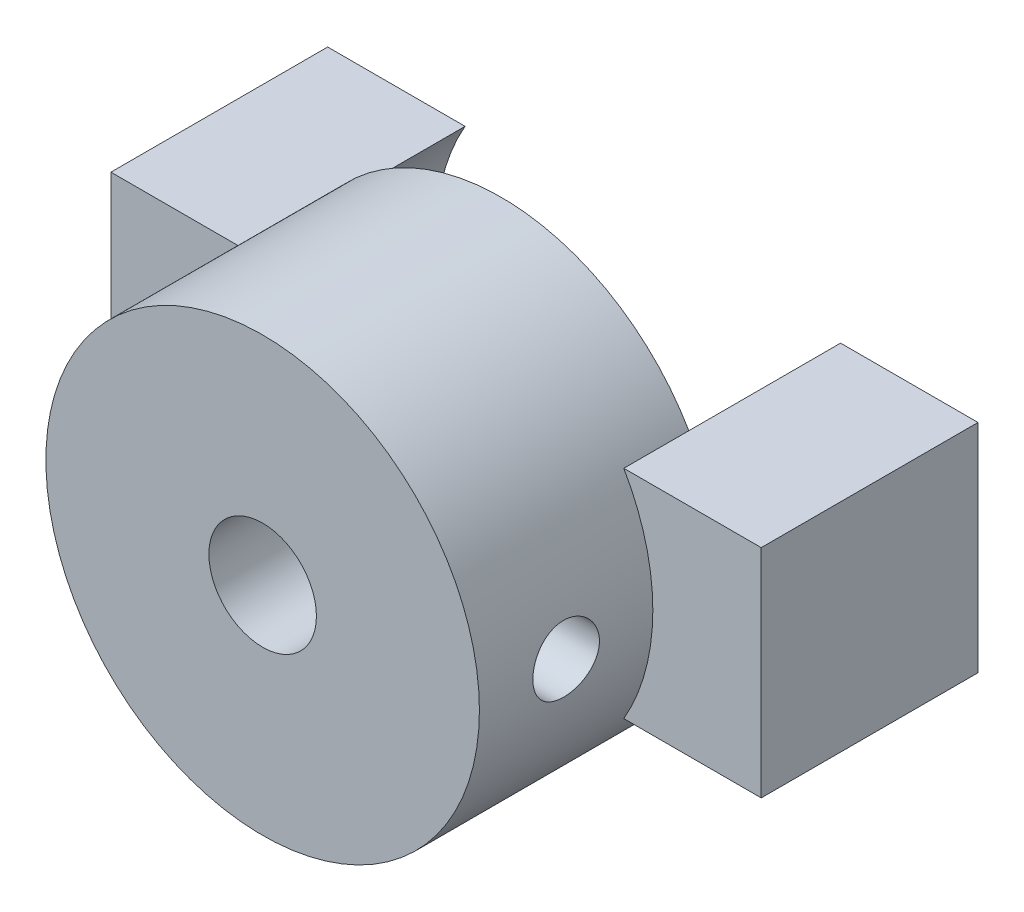
ISO-10303-21;
HEADER;
FILE_DESCRIPTION(('STEP AP214'),'2;1');
FILE_NAME('part.step','',(''),(''),'','','');
FILE_SCHEMA(('AUTOMOTIVE_DESIGN { 1 0 10303 214 1 1 1 1 }'));
ENDSEC;
DATA;
#1=APPLICATION_CONTEXT('core data for automotive mechanical design processes');
#2=APPLICATION_PROTOCOL_DEFINITION('international standard','automotive_design',2000,#1);
#3=PRODUCT_CONTEXT('',#1,'mechanical');
#4=PRODUCT('Part','Part','',(#3));
#5=PRODUCT_RELATED_PRODUCT_CATEGORY('part','',(#4));
#6=PRODUCT_DEFINITION_FORMATION('','',#4);
#7=PRODUCT_DEFINITION_CONTEXT('part definition',#1,'design');
#8=PRODUCT_DEFINITION('design','',#6,#7);
#9=PRODUCT_DEFINITION_SHAPE('','',#8);
#10=(LENGTH_UNIT() NAMED_UNIT(*) SI_UNIT(.MILLI.,.METRE.));
#11=(NAMED_UNIT(*) PLANE_ANGLE_UNIT() SI_UNIT($,.RADIAN.));
#12=(NAMED_UNIT(*) SI_UNIT($,.STERADIAN.) SOLID_ANGLE_UNIT());
#13=UNCERTAINTY_MEASURE_WITH_UNIT(LENGTH_MEASURE(1.E-05),#10,'distance_accuracy_value','');
#14=(GEOMETRIC_REPRESENTATION_CONTEXT(3) GLOBAL_UNCERTAINTY_ASSIGNED_CONTEXT((#13)) GLOBAL_UNIT_ASSIGNED_CONTEXT((#10,
#11,#12)) REPRESENTATION_CONTEXT('',''));
#15=CARTESIAN_POINT('',(0.,0.,0.));
#16=DIRECTION('',(0.,0.,1.));
#17=DIRECTION('',(1.,0.,0.));
#18=AXIS2_PLACEMENT_3D('',#15,#16,#17);
#19=CARTESIAN_POINT('',(0.,0.,10.16));
#20=DIRECTION('',(0.,0.,-1.));
#21=DIRECTION('',(-1.,0.,0.));
#22=AXIS2_PLACEMENT_3D('',#19,#20,#21);
#23=CYLINDRICAL_SURFACE('',#22,12.7);
#24=CARTESIAN_POINT('',(12.7,0.,3.13));
#25=CARTESIAN_POINT('',(12.6999982276334,-0.108845962136207,3.130004464785));
#26=CARTESIAN_POINT('',(12.6985860490651,-0.21775431783551,3.13914418871415));
#27=CARTESIAN_POINT('',(12.6930885153027,-0.432524757757705,3.1754511307624));
#28=CARTESIAN_POINT('',(12.689000586835,-0.538383807040032,3.20263570300041));
#29=CARTESIAN_POINT('',(12.6786107656927,-0.743916574575621,3.27419911693747));
#30=CARTESIAN_POINT('',(12.6723105749625,-0.843594978578481,3.31856474354612));
#31=CARTESIAN_POINT('',(12.6581916935447,-1.03407773570442,3.42319811174313));
#32=CARTESIAN_POINT('',(12.6503732061462,-1.12488327439649,3.48346372482443));
#33=CARTESIAN_POINT('',(12.634015193839,-1.29579923293581,3.61871077048814));
#34=CARTESIAN_POINT('',(12.6254708178505,-1.37582665711002,3.69379651169237));
#35=CARTESIAN_POINT('',(12.6086618295812,-1.52219845371974,3.85632792478003));
#36=CARTESIAN_POINT('',(12.6003972337249,-1.588542024011,3.94377432073599));
#37=CARTESIAN_POINT('',(12.5850365060908,-1.70598792216229,4.12910499744861));
#38=CARTESIAN_POINT('',(12.5779466438119,-1.75700958251657,4.22704096277609));
#39=CARTESIAN_POINT('',(12.5658045845477,-1.84184776138051,4.43021959923667));
#40=CARTESIAN_POINT('',(12.5607522711357,-1.87566526297326,4.53546185248191));
#41=CARTESIAN_POINT('',(12.5533051710426,-1.92487663642757,4.74939129218672));
#42=CARTESIAN_POINT('',(12.5508898627073,-1.94041285141828,4.85804500714838));
#43=CARTESIAN_POINT('',(12.5489279877153,-1.95306167734145,5.07644203520657));
#44=CARTESIAN_POINT('',(12.5493812485684,-1.95017539603901,5.18618528239212));
#45=CARTESIAN_POINT('',(12.5530865393468,-1.92617740739112,5.4026384856099));
#46=CARTESIAN_POINT('',(12.5563141805778,-1.90522451289819,5.50936652684885));
#47=CARTESIAN_POINT('',(12.5651664439985,-1.84593680702185,5.7177739287614));
#48=CARTESIAN_POINT('',(12.5707911369561,-1.80760148245623,5.81945314027986));
#49=CARTESIAN_POINT('',(12.5838305605825,-1.71447279252728,6.01535819384564));
#50=CARTESIAN_POINT('',(12.5912525536625,-1.65961242876382,6.10955168321464));
#51=CARTESIAN_POINT('',(12.6070450996551,-1.5350386290733,6.28745627807981));
#52=CARTESIAN_POINT('',(12.6154157177334,-1.46532417245795,6.37116666260907));
#53=CARTESIAN_POINT('',(12.6322699924622,-1.31215069403324,6.52664900715174));
#54=CARTESIAN_POINT('',(12.6407539139063,-1.22855518719407,6.59828654843457));
#55=CARTESIAN_POINT('',(12.6567974172646,-1.05045702232487,6.72653625053314));
#56=CARTESIAN_POINT('',(12.664356994773,-0.955954312312517,6.78314833973529));
#57=CARTESIAN_POINT('',(12.6777085014377,-0.758605798799996,6.87974812302985));
#58=CARTESIAN_POINT('',(12.6834992946071,-0.655754687046985,6.91972513933148));
#59=CARTESIAN_POINT('',(12.6926513527298,-0.444689917145736,6.9818015107654));
#60=CARTESIAN_POINT('',(12.6960127898596,-0.336476639612886,7.00390213287006));
#61=CARTESIAN_POINT('',(12.6999045182832,-0.118919124610768,7.02941890977015));
#62=CARTESIAN_POINT('',(12.7004628013309,-0.00959703767195736,7.03301980767911));
#63=CARTESIAN_POINT('',(12.6987616105735,0.208089540710071,7.02192572804797));
#64=CARTESIAN_POINT('',(12.696502228297,0.316454063143514,7.007231344809));
#65=CARTESIAN_POINT('',(12.6894368877889,0.528587595405808,6.96011745543652));
#66=CARTESIAN_POINT('',(12.6846439073081,0.632377130595833,6.92778825275461));
#67=CARTESIAN_POINT('',(12.6730469560241,0.833062763389067,6.84641787269893));
#68=CARTESIAN_POINT('',(12.6662428869044,0.929958523687307,6.79737587826511));
#69=CARTESIAN_POINT('',(12.6513100570549,1.1149164346843,6.68354072442314));
#70=CARTESIAN_POINT('',(12.6431716258307,1.20290588834609,6.61863073992604));
#71=CARTESIAN_POINT('',(12.626505207449,1.36680863824156,6.47506441329139));
#72=CARTESIAN_POINT('',(12.6179771965319,1.44272119666003,6.39640723191031));
#73=CARTESIAN_POINT('',(12.6014036593707,1.58099007290304,6.22675558040914));
#74=CARTESIAN_POINT('',(12.5933629915018,1.64322234551384,6.13565946402289));
#75=CARTESIAN_POINT('',(12.5787615338997,1.7515010437453,5.94419811154869));
#76=CARTESIAN_POINT('',(12.5722007026998,1.79754792291831,5.8438331352953));
#77=CARTESIAN_POINT('',(12.561337197173,1.87195784516515,5.63704823266879));
#78=CARTESIAN_POINT('',(12.5570262887373,1.90038544274173,5.53065198748207));
#79=CARTESIAN_POINT('',(12.5511290813638,1.9389548572117,5.31452394717424));
#80=CARTESIAN_POINT('',(12.5495425844558,1.94909800275374,5.20479239500412));
#81=CARTESIAN_POINT('',(12.5492814572718,1.95077786083979,4.98634545642706));
#82=CARTESIAN_POINT('',(12.5505762972209,1.94250965387869,4.8776315566246));
#83=CARTESIAN_POINT('',(12.5558654830242,1.90802033015738,4.66316020534619));
#84=CARTESIAN_POINT('',(12.5598598237104,1.88179924776693,4.5574027482107));
#85=CARTESIAN_POINT('',(12.5700870851371,1.81221866981808,4.35190479131503));
#86=CARTESIAN_POINT('',(12.5763181397021,1.76887345854965,4.25215935628157));
#87=CARTESIAN_POINT('',(12.5903189163086,1.6662945586338,4.06132481821611));
#88=CARTESIAN_POINT('',(12.5980886954519,1.6070602803165,3.97023603661696));
#89=CARTESIAN_POINT('',(12.6143893449349,1.47367847256626,3.79831044547203));
#90=CARTESIAN_POINT('',(12.6229270971098,1.39938664760008,3.71758622091338));
#91=CARTESIAN_POINT('',(12.6397447796645,1.23830356168367,3.56968156742053));
#92=CARTESIAN_POINT('',(12.6480246497599,1.15150940437168,3.50250428552711));
#93=CARTESIAN_POINT('',(12.6634485299814,0.967293481924451,3.38325156252319));
#94=CARTESIAN_POINT('',(12.6705856945888,0.869813160496973,3.33126570115031));
#95=CARTESIAN_POINT('',(12.6828530197754,0.667439403604569,3.24448338786865));
#96=CARTESIAN_POINT('',(12.6879852416708,0.562553713460968,3.20966927166806));
#97=CARTESIAN_POINT('',(12.6945033773618,0.381008356580817,3.16604732211229));
#98=CARTESIAN_POINT('',(12.6965539372985,0.305464955091029,3.15255043512586));
#99=CARTESIAN_POINT('',(12.6993028637487,0.153291342851657,3.13452526157265));
#100=CARTESIAN_POINT('',(12.700001248293,0.0766611466079173,3.12999685541355));
#101=CARTESIAN_POINT('',(12.7,0.,3.13));
#102=B_SPLINE_CURVE_WITH_KNOTS('',3,(#24,#25,#26,#27,#28,#29,#30,#31,#32,#33,#34,#35,#36,#37,
#38,#39,#40,#41,#42,#43,#44,#45,#46,#47,#48,#49,#50,#51,#52,#53,#54,#55,#56,#57,#58,#59,#60,#61,
#62,#63,#64,#65,#66,#67,#68,#69,#70,#71,#72,#73,#74,#75,#76,#77,#78,#79,#80,#81,#82,#83,#84,#85,
#86,#87,#88,#89,#90,#91,#92,#93,#94,#95,#96,#97,#98,#99,#100,#101),.UNSPECIFIED.,.T.,.F.,(4,2,2,
2,2,2,2,2,2,2,2,2,2,2,2,2,2,2,2,2,2,2,2,2,2,2,2,2,2,2,2,2,2,2,2,2,2,2,4),(0.,0.326257740046548,
0.652829704663501,0.979150978396898,1.30542859014229,1.63409026158308,1.96277119362059,
2.29315340758684,2.62351674067304,2.95129038552863,3.27904432117752,3.60394620247928,
3.92885767649744,4.25510460544013,4.58137395943912,4.91106523946338,5.24075809081855,
5.5706622415794,5.9005430086495,6.22712300596696,6.55369239498639,6.87860499265289,
7.20353347702476,7.53093031140613,7.85834713980652,8.18862041872349,8.51888444187742,
8.84793115938441,9.1769539655867,9.50250716285398,9.82805973687012,10.1533413189052,
10.4786349743548,10.8072073182131,11.1358559038057,11.4664050471255,11.7966134471132,
12.0264026416452,12.2561887719784),.UNSPECIFIED.);
#103=CARTESIAN_POINT('',(12.7,0.,3.13));
#104=VERTEX_POINT('',#103);
#105=EDGE_CURVE('E173',#104,#104,#102,.T.);
#106=ORIENTED_EDGE('',*,*,#105,.T.);
#107=EDGE_LOOP('',(#106));
#108=FACE_BOUND('',#107,.T.);
#109=CARTESIAN_POINT('',(0.,0.,10.16));
#110=DIRECTION('',(0.,0.,1.));
#111=DIRECTION('',(1.,0.,0.));
#112=AXIS2_PLACEMENT_3D('',#109,#110,#111);
#113=CIRCLE('',#112,12.7);
#114=CARTESIAN_POINT('',(12.7,0.,10.16));
#115=VERTEX_POINT('',#114);
#116=EDGE_CURVE('E11',#115,#115,#113,.T.);
#117=ORIENTED_EDGE('',*,*,#116,.F.);
#118=EDGE_LOOP('',(#117));
#119=FACE_BOUND('',#118,.T.);
#120=CARTESIAN_POINT('',(0.,0.,-3.81));
#121=DIRECTION('',(0.,0.,-1.));
#122=DIRECTION('',(-1.,0.,0.));
#123=AXIS2_PLACEMENT_3D('',#120,#121,#122);
#124=CIRCLE('',#123,12.7);
#125=CARTESIAN_POINT('',(-10.9985226280624,6.35,-3.81));
#126=VERTEX_POINT('',#125);
#127=CARTESIAN_POINT('',(10.9985226280624,6.35,-3.81));
#128=VERTEX_POINT('',#127);
#129=EDGE_CURVE('E145',#126,#128,#124,.T.);
#130=ORIENTED_EDGE('',*,*,#129,.F.);
#131=DIRECTION('',(0.,0.,1.));
#132=VECTOR('',#131,1.);
#133=CARTESIAN_POINT('',(-10.9985226280624,6.35,-6.35));
#134=LINE('',#133,#132);
#135=CARTESIAN_POINT('',(-10.9985226280624,6.35,0.));
#136=VERTEX_POINT('',#135);
#137=EDGE_CURVE('E136',#126,#136,#134,.T.);
#138=ORIENTED_EDGE('',*,*,#137,.T.);
#139=CARTESIAN_POINT('',(0.,0.,0.));
#140=DIRECTION('',(0.,0.,1.));
#141=DIRECTION('',(1.,0.,0.));
#142=AXIS2_PLACEMENT_3D('',#139,#140,#141);
#143=CIRCLE('',#142,12.7);
#144=CARTESIAN_POINT('',(-10.9985226280624,-6.35,0.));
#145=VERTEX_POINT('',#144);
#146=EDGE_CURVE('E60',#136,#145,#143,.T.);
#147=ORIENTED_EDGE('',*,*,#146,.T.);
#148=DIRECTION('',(0.,0.,1.));
#149=VECTOR('',#148,1.);
#150=CARTESIAN_POINT('',(-10.9985226280624,-6.35,-6.35));
#151=LINE('',#150,#149);
#152=CARTESIAN_POINT('',(-10.9985226280624,-6.35,-3.81));
#153=VERTEX_POINT('',#152);
#154=EDGE_CURVE('E252',#153,#145,#151,.T.);
#155=ORIENTED_EDGE('',*,*,#154,.F.);
#156=CARTESIAN_POINT('',(10.9985226280624,-6.35,-3.81));
#157=VERTEX_POINT('',#156);
#158=EDGE_CURVE('E148',#157,#153,#124,.T.);
#159=ORIENTED_EDGE('',*,*,#158,.F.);
#160=DIRECTION('',(0.,0.,1.));
#161=VECTOR('',#160,1.);
#162=CARTESIAN_POINT('',(10.9985226280624,-6.35,-6.35));
#163=LINE('',#162,#161);
#164=CARTESIAN_POINT('',(10.9985226280624,-6.35,0.));
#165=VERTEX_POINT('',#164);
#166=EDGE_CURVE('E284',#157,#165,#163,.T.);
#167=ORIENTED_EDGE('',*,*,#166,.T.);
#168=CARTESIAN_POINT('',(10.9985226280624,6.35,0.));
#169=VERTEX_POINT('',#168);
#170=EDGE_CURVE('E51',#165,#169,#143,.T.);
#171=ORIENTED_EDGE('',*,*,#170,.T.);
#172=DIRECTION('',(0.,0.,1.));
#173=VECTOR('',#172,1.);
#174=CARTESIAN_POINT('',(10.9985226280624,6.35,-6.35));
#175=LINE('',#174,#173);
#176=EDGE_CURVE('E75',#128,#169,#175,.T.);
#177=ORIENTED_EDGE('',*,*,#176,.F.);
#178=EDGE_LOOP('',(#130,#138,#147,#155,#159,#167,#171,#177));
#179=FACE_BOUND('',#178,.T.);
#180=ADVANCED_FACE('F50',(#108,#119,#179),#23,.T.);
#181=CARTESIAN_POINT('',(0.,0.,10.16));
#182=DIRECTION('',(0.,0.,-1.));
#183=DIRECTION('',(-1.,0.,0.));
#184=AXIS2_PLACEMENT_3D('',#181,#182,#183);
#185=CYLINDRICAL_SURFACE('',#184,3.15);
#186=CARTESIAN_POINT('',(0.,0.,10.16));
#187=DIRECTION('',(0.,0.,1.));
#188=DIRECTION('',(1.,0.,0.));
#189=AXIS2_PLACEMENT_3D('',#186,#187,#188);
#190=CIRCLE('',#189,3.15);
#191=CARTESIAN_POINT('',(3.15,0.,10.16));
#192=VERTEX_POINT('',#191);
#193=EDGE_CURVE('E247',#192,#192,#190,.T.);
#194=ORIENTED_EDGE('',*,*,#193,.T.);
#195=EDGE_LOOP('',(#194));
#196=FACE_BOUND('',#195,.T.);
#197=CARTESIAN_POINT('',(3.15,0.,3.13));
#198=CARTESIAN_POINT('',(3.14999286915292,0.099235300450367,3.1300077942239));
#199=CARTESIAN_POINT('',(3.14526063512884,0.198602549315856,3.13762748700982));
#200=CARTESIAN_POINT('',(3.12677769282048,0.394301653998527,3.16770459497267));
#201=CARTESIAN_POINT('',(3.11300855590574,0.490626884723136,3.19019233070735));
#202=CARTESIAN_POINT('',(3.07783975892777,0.677019183431156,3.24870529450902));
#203=CARTESIAN_POINT('',(3.0564779267164,0.767114677319883,3.28466345813917));
#204=CARTESIAN_POINT('',(3.00791191552407,0.939688134405094,3.3686537562841));
#205=CARTESIAN_POINT('',(2.98070856935087,1.02216718106193,3.41668416985936));
#206=CARTESIAN_POINT('',(2.92017845380478,1.18454427860935,3.52765400029217));
#207=CARTESIAN_POINT('',(2.88653757075525,1.26372248552529,3.59147202971562));
#208=CARTESIAN_POINT('',(2.81750651472859,1.41095153486623,3.73019766510358));
#209=CARTESIAN_POINT('',(2.78211405880263,1.47898732919429,3.80512001194123));
#210=CARTESIAN_POINT('',(2.7079766560378,1.61115657983223,3.97555405540527));
#211=CARTESIAN_POINT('',(2.66940789268077,1.67358205557301,4.07247836504472));
#212=CARTESIAN_POINT('',(2.59893543766463,1.78106097869747,4.27770350373011));
#213=CARTESIAN_POINT('',(2.56702062048875,1.82614353220165,4.38598488031359));
#214=CARTESIAN_POINT('',(2.52201518526769,1.88759222535483,4.58276599834624));
#215=CARTESIAN_POINT('',(2.50619953911221,1.90834982340401,4.66926741304158));
#216=CARTESIAN_POINT('',(2.4834368798423,1.93788578713509,4.84538640902184));
#217=CARTESIAN_POINT('',(2.47647771265913,1.94668057096667,4.93499954598849));
#218=CARTESIAN_POINT('',(2.47247099176303,1.95176870245966,5.11503088278132));
#219=CARTESIAN_POINT('',(2.47544774184583,1.94803139584101,5.20545051631971));
#220=CARTESIAN_POINT('',(2.4908925727401,1.92823792702467,5.38412620017646));
#221=CARTESIAN_POINT('',(2.50336815840901,1.91217202414812,5.47238048275099));
#222=CARTESIAN_POINT('',(2.5356979976706,1.86907289273654,5.6427057142248));
#223=CARTESIAN_POINT('',(2.55539731524901,1.84226893328627,5.72486581872549));
#224=CARTESIAN_POINT('',(2.60002273021062,1.77873150397707,5.88370445582751));
#225=CARTESIAN_POINT('',(2.62495068963745,1.7419944953723,5.96038102253085));
#226=CARTESIAN_POINT('',(2.68276506783286,1.65185763853035,6.12107917717204));
#227=CARTESIAN_POINT('',(2.7162718204192,1.59663543657216,6.20385522807219));
#228=CARTESIAN_POINT('',(2.78444261840559,1.47454360310611,6.35986258590528));
#229=CARTESIAN_POINT('',(2.81910780692786,1.40766217468757,6.43308409298552));
#230=CARTESIAN_POINT('',(2.89215001280742,1.25160299966916,6.57973100727668));
#231=CARTESIAN_POINT('',(2.93024379025482,1.16057139435576,6.6513470395437));
#232=CARTESIAN_POINT('',(3.00016269546632,0.965523367876058,6.77816685123575));
#233=CARTESIAN_POINT('',(3.03199053123978,0.861512587933368,6.83337772590542));
#234=CARTESIAN_POINT('',(3.08420983114287,0.649161006306949,6.92216276751809));
#235=CARTESIAN_POINT('',(3.10514646823449,0.541398153006676,6.95678438002747));
#236=CARTESIAN_POINT('',(3.13568473424298,0.32001119161934,7.00689463644725));
#237=CARTESIAN_POINT('',(3.14530179961237,0.206395286664983,7.02240933771346));
#238=CARTESIAN_POINT('',(3.15151432397433,-0.00546861350527226,7.03244590079086));
#239=CARTESIAN_POINT('',(3.14980002931915,-0.103548749275228,7.02969247841794));
#240=CARTESIAN_POINT('',(3.13741433925989,-0.297618902615755,7.00961989827625));
#241=CARTESIAN_POINT('',(3.12674343740998,-0.39360903505702,6.99230154310855));
#242=CARTESIAN_POINT('',(3.09797053827178,-0.577444973022115,6.94487529312099));
#243=CARTESIAN_POINT('',(3.08014473598175,-0.665458757425228,6.91524144299286));
#244=CARTESIAN_POINT('',(3.03851920956829,-0.835191609820923,6.84448750206164));
#245=CARTESIAN_POINT('',(3.01471844765915,-0.91690958107327,6.80336541573631));
#246=CARTESIAN_POINT('',(2.96017858662397,-1.08075790686589,6.70617344166919));
#247=CARTESIAN_POINT('',(2.9289797277938,-1.16208268084729,6.64900774297299));
#248=CARTESIAN_POINT('',(2.8637913133343,-1.31456903021231,6.52366488003057));
#249=CARTESIAN_POINT('',(2.8297986278767,-1.38571895579062,6.45547528109691));
#250=CARTESIAN_POINT('',(2.75682470466363,-1.52628156374153,6.29883560196523));
#251=CARTESIAN_POINT('',(2.71781965443286,-1.59401696945443,6.20888367725699));
#252=CARTESIAN_POINT('',(2.64404172745577,-1.71361700568382,6.01740708654329));
#253=CARTESIAN_POINT('',(2.60926553231172,-1.76549412928288,5.91589161724282));
#254=CARTESIAN_POINT('',(2.55543804399554,-1.84226898189968,5.72554027102841));
#255=CARTESIAN_POINT('',(2.53461605810101,-1.87055475077666,5.63857867125592));
#256=CARTESIAN_POINT('',(2.50136195097326,-1.91480196328633,5.46007708008201));
#257=CARTESIAN_POINT('',(2.48891702276653,-1.9307822251761,5.36854430837331));
#258=CARTESIAN_POINT('',(2.47426216897717,-1.94953379910946,5.18279657585727));
#259=CARTESIAN_POINT('',(2.47210562179362,-1.9522362249568,5.08857017281135));
#260=CARTESIAN_POINT('',(2.47855334555339,-1.94404094495881,4.90106486872617));
#261=CARTESIAN_POINT('',(2.48716189803781,-1.9331378278629,4.80778635956596));
#262=CARTESIAN_POINT('',(2.51274270151326,-1.89974090338509,4.63173938299324));
#263=CARTESIAN_POINT('',(2.52906468551694,-1.87814288077303,4.54869881104326));
#264=CARTESIAN_POINT('',(2.5677799928179,-1.82485243864525,4.38744430558683));
#265=CARTESIAN_POINT('',(2.59017575434264,-1.79315596436166,4.30923232595956));
#266=CARTESIAN_POINT('',(2.64253901833565,-1.71522479329178,4.14741281925831));
#267=CARTESIAN_POINT('',(2.6731362283825,-1.66753463930057,4.06471332007788));
#268=CARTESIAN_POINT('',(2.73663491161923,-1.56114562162661,3.90767981545853));
#269=CARTESIAN_POINT('',(2.76953826091724,-1.50243772802181,3.83335275243483));
#270=CARTESIAN_POINT('',(2.84129230861052,-1.3626557916,3.68060148376245));
#271=CARTESIAN_POINT('',(2.88008583640388,-1.27945154157533,3.6040796555974));
#272=CARTESIAN_POINT('',(2.95336036592152,-1.09981419024616,3.46575941198647));
#273=CARTESIAN_POINT('',(2.98783898751279,-1.00337384877451,3.40396910569477));
#274=CARTESIAN_POINT('',(3.04864310154913,-0.799647328930234,3.29783541033309));
#275=CARTESIAN_POINT('',(3.07502198821313,-0.692438645836863,3.253377217854));
#276=CARTESIAN_POINT('',(3.10632047866945,-0.525820916577556,3.20132808551453));
#277=CARTESIAN_POINT('',(3.11537022894629,-0.46937166791411,3.18642543613451));
#278=CARTESIAN_POINT('',(3.13046214205355,-0.354993550139166,3.16169549942138));
#279=CARTESIAN_POINT('',(3.13650659337869,-0.297065842304466,3.15186434999449));
#280=CARTESIAN_POINT('',(3.14394591308476,-0.199191179208684,3.13979131477322));
#281=CARTESIAN_POINT('',(3.14621194149288,-0.159478840858811,3.13612384346702));
#282=CARTESIAN_POINT('',(3.149240465171,-0.079851466483505,3.13122654420254));
#283=CARTESIAN_POINT('',(3.15000286974989,-0.0399364183771911,3.12999686327965));
#284=CARTESIAN_POINT('',(3.15,0.,3.13));
#285=B_SPLINE_CURVE_WITH_KNOTS('',3,(#197,#198,#199,#200,#201,#202,#203,#204,#205,#206,#207,
#208,#209,#210,#211,#212,#213,#214,#215,#216,#217,#218,#219,#220,#221,#222,#223,#224,#225,#226,
#227,#228,#229,#230,#231,#232,#233,#234,#235,#236,#237,#238,#239,#240,#241,#242,#243,#244,#245,
#246,#247,#248,#249,#250,#251,#252,#253,#254,#255,#256,#257,#258,#259,#260,#261,#262,#263,#264,
#265,#266,#267,#268,#269,#270,#271,#272,#273,#274,#275,#276,#277,#278,#279,#280,#281,#282,#283,
#284),.UNSPECIFIED.,.T.,.F.,(4,2,2,2,2,2,2,2,2,2,2,2,2,2,2,2,2,2,2,2,2,2,2,2,2,2,2,2,2,2,2,2,2,
2,2,2,2,2,2,2,2,2,2,4),(0.,0.297544674254619,0.595698013878419,0.89238626744773,
1.18903225107996,1.50913593664668,1.82966842723728,2.19261981776259,2.55495939213586,
2.8248855372941,3.09444085210422,3.36465599663368,3.63508485506166,3.90002373359548,
4.16505712384406,4.47887010394222,4.79300246554832,5.15695489127978,5.52074967738764,
5.86396126140059,6.20670426494761,6.49960503762451,6.79248967105288,7.07501470806382,
7.35758885060344,7.66894119826257,7.98064722601339,8.33655753401257,8.69218673058113,
8.9724244176733,9.2522326941096,9.53349111063995,9.81486142604699,10.0758719129674,
10.3369873341493,10.6366508181776,10.936560981618,11.2934246018156,11.6504842109197,
12.0051368477055,12.1821208333342,12.3589698408373,12.4787069897407,12.598451360373),.UNSPECIFIED.);
#286=CARTESIAN_POINT('',(3.15,0.,3.13));
#287=VERTEX_POINT('',#286);
#288=EDGE_CURVE('E139',#287,#287,#285,.T.);
#289=ORIENTED_EDGE('',*,*,#288,.T.);
#290=EDGE_LOOP('',(#289));
#291=FACE_BOUND('',#290,.T.);
#292=CARTESIAN_POINT('',(0.,0.,-3.81));
#293=DIRECTION('',(0.,0.,-1.));
#294=DIRECTION('',(-1.,0.,0.));
#295=AXIS2_PLACEMENT_3D('',#292,#293,#294);
#296=CIRCLE('',#295,3.15);
#297=CARTESIAN_POINT('',(-3.15,0.,-3.81));
#298=VERTEX_POINT('',#297);
#299=EDGE_CURVE('E154',#298,#298,#296,.T.);
#300=ORIENTED_EDGE('',*,*,#299,.T.);
#301=EDGE_LOOP('',(#300));
#302=FACE_BOUND('',#301,.T.);
#303=ADVANCED_FACE('F227',(#196,#291,#302),#185,.F.);
#304=CARTESIAN_POINT('',(0.,0.,10.16));
#305=DIRECTION('',(0.,0.,1.));
#306=DIRECTION('',(1.,0.,0.));
#307=AXIS2_PLACEMENT_3D('',#304,#305,#306);
#308=PLANE('',#307);
#309=ORIENTED_EDGE('',*,*,#116,.T.);
#310=EDGE_LOOP('',(#309));
#311=FACE_BOUND('',#310,.T.);
#312=ORIENTED_EDGE('',*,*,#193,.F.);
#313=EDGE_LOOP('',(#312));
#314=FACE_BOUND('',#313,.T.);
#315=ADVANCED_FACE('F231',(#311,#314),#308,.T.);
#316=CARTESIAN_POINT('',(-12.701,0.,5.08));
#317=DIRECTION('',(1.,0.,0.));
#318=DIRECTION('',(0.,0.,-1.));
#319=AXIS2_PLACEMENT_3D('',#316,#317,#318);
#320=CYLINDRICAL_SURFACE('',#319,1.95);
#321=ORIENTED_EDGE('',*,*,#288,.F.);
#322=EDGE_LOOP('',(#321));
#323=FACE_BOUND('',#322,.T.);
#324=ORIENTED_EDGE('',*,*,#105,.F.);
#325=EDGE_LOOP('',(#324));
#326=FACE_BOUND('',#325,.T.);
#327=ADVANCED_FACE('F179',(#323,#326),#320,.F.);
#328=CARTESIAN_POINT('',(0.,0.,0.));
#329=DIRECTION('',(0.,0.,-1.));
#330=DIRECTION('',(-1.,0.,0.));
#331=AXIS2_PLACEMENT_3D('',#328,#329,#330);
#332=PLANE('',#331);
#333=ORIENTED_EDGE('',*,*,#146,.F.);
#334=DIRECTION('',(-1.,0.,0.));
#335=VECTOR('',#334,1.);
#336=CARTESIAN_POINT('',(0.,6.35,0.));
#337=LINE('',#336,#335);
#338=CARTESIAN_POINT('',(-19.05,6.35,0.));
#339=VERTEX_POINT('',#338);
#340=EDGE_CURVE('E157',#136,#339,#337,.T.);
#341=ORIENTED_EDGE('',*,*,#340,.T.);
#342=DIRECTION('',(0.,1.,0.));
#343=VECTOR('',#342,1.);
#344=CARTESIAN_POINT('',(-19.05,0.,0.));
#345=LINE('',#344,#343);
#346=CARTESIAN_POINT('',(-19.05,-6.35,0.));
#347=VERTEX_POINT('',#346);
#348=EDGE_CURVE('E259',#347,#339,#345,.T.);
#349=ORIENTED_EDGE('',*,*,#348,.F.);
#350=DIRECTION('',(-1.,0.,0.));
#351=VECTOR('',#350,1.);
#352=CARTESIAN_POINT('',(0.,-6.35,0.));
#353=LINE('',#352,#351);
#354=EDGE_CURVE('E260',#145,#347,#353,.T.);
#355=ORIENTED_EDGE('',*,*,#354,.F.);
#356=EDGE_LOOP('',(#333,#341,#349,#355));
#357=FACE_BOUND('',#356,.T.);
#358=ADVANCED_FACE('F186',(#357),#332,.F.);
#359=CARTESIAN_POINT('',(0.,6.35,-6.35));
#360=DIRECTION('',(0.,1.,0.));
#361=DIRECTION('',(0.,0.,1.));
#362=AXIS2_PLACEMENT_3D('',#359,#360,#361);
#363=PLANE('',#362);
#364=ORIENTED_EDGE('',*,*,#340,.F.);
#365=ORIENTED_EDGE('',*,*,#137,.F.);
#366=CARTESIAN_POINT('',(-10.9985226280624,6.35,-12.7));
#367=VERTEX_POINT('',#366);
#368=EDGE_CURVE('E126',#367,#126,#134,.T.);
#369=ORIENTED_EDGE('',*,*,#368,.F.);
#370=DIRECTION('',(1.,0.,0.));
#371=VECTOR('',#370,1.);
#372=CARTESIAN_POINT('',(0.,6.35,-12.7));
#373=LINE('',#372,#371);
#374=CARTESIAN_POINT('',(-19.05,6.35,-12.7));
#375=VERTEX_POINT('',#374);
#376=EDGE_CURVE('E316',#375,#367,#373,.T.);
#377=ORIENTED_EDGE('',*,*,#376,.F.);
#378=DIRECTION('',(0.,0.,1.));
#379=VECTOR('',#378,1.);
#380=CARTESIAN_POINT('',(-19.05,6.35,-6.35));
#381=LINE('',#380,#379);
#382=EDGE_CURVE('E266',#375,#339,#381,.T.);
#383=ORIENTED_EDGE('',*,*,#382,.T.);
#384=EDGE_LOOP('',(#364,#365,#369,#377,#383));
#385=FACE_BOUND('',#384,.T.);
#386=ADVANCED_FACE('F160',(#385),#363,.T.);
#387=CARTESIAN_POINT('',(0.,6.35,-6.35));
#388=DIRECTION('',(0.,1.,0.));
#389=DIRECTION('',(0.,0.,1.));
#390=AXIS2_PLACEMENT_3D('',#387,#388,#389);
#391=PLANE('',#390);
#392=DIRECTION('',(-1.,0.,0.));
#393=VECTOR('',#392,1.);
#394=CARTESIAN_POINT('',(0.,6.35,0.));
#395=LINE('',#394,#393);
#396=CARTESIAN_POINT('',(19.05,6.35,0.));
#397=VERTEX_POINT('',#396);
#398=EDGE_CURVE('E296',#397,#169,#395,.T.);
#399=ORIENTED_EDGE('',*,*,#398,.F.);
#400=DIRECTION('',(0.,0.,1.));
#401=VECTOR('',#400,1.);
#402=CARTESIAN_POINT('',(19.05,6.35,-6.35));
#403=LINE('',#402,#401);
#404=CARTESIAN_POINT('',(19.05,6.35,-12.7));
#405=VERTEX_POINT('',#404);
#406=EDGE_CURVE('E290',#405,#397,#403,.T.);
#407=ORIENTED_EDGE('',*,*,#406,.F.);
#408=DIRECTION('',(1.,0.,0.));
#409=VECTOR('',#408,1.);
#410=CARTESIAN_POINT('',(0.,6.35,-12.7));
#411=LINE('',#410,#409);
#412=CARTESIAN_POINT('',(10.9985226280624,6.35,-12.7));
#413=VERTEX_POINT('',#412);
#414=EDGE_CURVE('E301',#413,#405,#411,.T.);
#415=ORIENTED_EDGE('',*,*,#414,.F.);
#416=EDGE_CURVE('E161',#413,#128,#175,.T.);
#417=ORIENTED_EDGE('',*,*,#416,.T.);
#418=ORIENTED_EDGE('',*,*,#176,.T.);
#419=EDGE_LOOP('',(#399,#407,#415,#417,#418));
#420=FACE_BOUND('',#419,.T.);
#421=ADVANCED_FACE('F189',(#420),#391,.T.);
#422=CARTESIAN_POINT('',(19.05,0.,-6.35));
#423=DIRECTION('',(1.,0.,0.));
#424=DIRECTION('',(0.,1.,0.));
#425=AXIS2_PLACEMENT_3D('',#422,#423,#424);
#426=PLANE('',#425);
#427=DIRECTION('',(0.,1.,0.));
#428=VECTOR('',#427,1.);
#429=CARTESIAN_POINT('',(19.05,0.,0.));
#430=LINE('',#429,#428);
#431=CARTESIAN_POINT('',(19.05,-6.35,0.));
#432=VERTEX_POINT('',#431);
#433=EDGE_CURVE('E267',#432,#397,#430,.T.);
#434=ORIENTED_EDGE('',*,*,#433,.F.);
#435=DIRECTION('',(0.,0.,1.));
#436=VECTOR('',#435,1.);
#437=CARTESIAN_POINT('',(19.05,-6.35,-6.35));
#438=LINE('',#437,#436);
#439=CARTESIAN_POINT('',(19.05,-6.35,-12.7));
#440=VERTEX_POINT('',#439);
#441=EDGE_CURVE('E282',#440,#432,#438,.T.);
#442=ORIENTED_EDGE('',*,*,#441,.F.);
#443=DIRECTION('',(0.,-1.,0.));
#444=VECTOR('',#443,1.);
#445=CARTESIAN_POINT('',(19.05,0.,-12.7));
#446=LINE('',#445,#444);
#447=EDGE_CURVE('E294',#405,#440,#446,.T.);
#448=ORIENTED_EDGE('',*,*,#447,.F.);
#449=ORIENTED_EDGE('',*,*,#406,.T.);
#450=EDGE_LOOP('',(#434,#442,#448,#449));
#451=FACE_BOUND('',#450,.T.);
#452=ADVANCED_FACE('F187',(#451),#426,.T.);
#453=CARTESIAN_POINT('',(0.,-6.35,-6.35));
#454=DIRECTION('',(0.,1.,0.));
#455=DIRECTION('',(-1.,0.,0.));
#456=AXIS2_PLACEMENT_3D('',#453,#454,#455);
#457=PLANE('',#456);
#458=DIRECTION('',(-1.,0.,0.));
#459=VECTOR('',#458,1.);
#460=CARTESIAN_POINT('',(0.,-6.35,0.));
#461=LINE('',#460,#459);
#462=EDGE_CURVE('E265',#432,#165,#461,.T.);
#463=ORIENTED_EDGE('',*,*,#462,.T.);
#464=ORIENTED_EDGE('',*,*,#166,.F.);
#465=CARTESIAN_POINT('',(10.9985226280624,-6.35,-12.7));
#466=VERTEX_POINT('',#465);
#467=EDGE_CURVE('E281',#466,#157,#163,.T.);
#468=ORIENTED_EDGE('',*,*,#467,.F.);
#469=DIRECTION('',(1.,0.,0.));
#470=VECTOR('',#469,1.);
#471=CARTESIAN_POINT('',(0.,-6.35,-12.7));
#472=LINE('',#471,#470);
#473=EDGE_CURVE('E324',#466,#440,#472,.T.);
#474=ORIENTED_EDGE('',*,*,#473,.T.);
#475=ORIENTED_EDGE('',*,*,#441,.T.);
#476=EDGE_LOOP('',(#463,#464,#468,#474,#475));
#477=FACE_BOUND('',#476,.T.);
#478=ADVANCED_FACE('F193',(#477),#457,.F.);
#479=CARTESIAN_POINT('',(0.,-6.35,-6.35));
#480=DIRECTION('',(0.,1.,0.));
#481=DIRECTION('',(-1.,0.,0.));
#482=AXIS2_PLACEMENT_3D('',#479,#480,#481);
#483=PLANE('',#482);
#484=ORIENTED_EDGE('',*,*,#354,.T.);
#485=DIRECTION('',(0.,0.,1.));
#486=VECTOR('',#485,1.);
#487=CARTESIAN_POINT('',(-19.05,-6.35,-6.35));
#488=LINE('',#487,#486);
#489=CARTESIAN_POINT('',(-19.05,-6.35,-12.7));
#490=VERTEX_POINT('',#489);
#491=EDGE_CURVE('E274',#490,#347,#488,.T.);
#492=ORIENTED_EDGE('',*,*,#491,.F.);
#493=DIRECTION('',(1.,0.,0.));
#494=VECTOR('',#493,1.);
#495=CARTESIAN_POINT('',(0.,-6.35,-12.7));
#496=LINE('',#495,#494);
#497=CARTESIAN_POINT('',(-10.9985226280624,-6.35,-12.7));
#498=VERTEX_POINT('',#497);
#499=EDGE_CURVE('E309',#490,#498,#496,.T.);
#500=ORIENTED_EDGE('',*,*,#499,.T.);
#501=EDGE_CURVE('E279',#498,#153,#151,.T.);
#502=ORIENTED_EDGE('',*,*,#501,.T.);
#503=ORIENTED_EDGE('',*,*,#154,.T.);
#504=EDGE_LOOP('',(#484,#492,#500,#502,#503));
#505=FACE_BOUND('',#504,.T.);
#506=ADVANCED_FACE('F197',(#505),#483,.F.);
#507=CARTESIAN_POINT('',(-19.05,0.,-6.35));
#508=DIRECTION('',(1.,0.,0.));
#509=DIRECTION('',(0.,0.,-1.));
#510=AXIS2_PLACEMENT_3D('',#507,#508,#509);
#511=PLANE('',#510);
#512=ORIENTED_EDGE('',*,*,#348,.T.);
#513=ORIENTED_EDGE('',*,*,#382,.F.);
#514=DIRECTION('',(0.,-1.,0.));
#515=VECTOR('',#514,1.);
#516=CARTESIAN_POINT('',(-19.05,0.,-12.7));
#517=LINE('',#516,#515);
#518=EDGE_CURVE('E308',#375,#490,#517,.T.);
#519=ORIENTED_EDGE('',*,*,#518,.T.);
#520=ORIENTED_EDGE('',*,*,#491,.T.);
#521=EDGE_LOOP('',(#512,#513,#519,#520));
#522=FACE_BOUND('',#521,.T.);
#523=ADVANCED_FACE('F203',(#522),#511,.F.);
#524=ORIENTED_EDGE('',*,*,#170,.F.);
#525=ORIENTED_EDGE('',*,*,#462,.F.);
#526=ORIENTED_EDGE('',*,*,#433,.T.);
#527=ORIENTED_EDGE('',*,*,#398,.T.);
#528=EDGE_LOOP('',(#524,#525,#526,#527));
#529=FACE_BOUND('',#528,.T.);
#530=ADVANCED_FACE('F202',(#529),#332,.F.);
#531=CARTESIAN_POINT('',(0.,0.,-12.7));
#532=DIRECTION('',(0.,0.,1.));
#533=DIRECTION('',(1.,0.,0.));
#534=AXIS2_PLACEMENT_3D('',#531,#532,#533);
#535=CYLINDRICAL_SURFACE('',#534,12.7);
#536=CARTESIAN_POINT('',(0.,0.,-12.7));
#537=DIRECTION('',(0.,0.,-1.));
#538=DIRECTION('',(-1.,0.,0.));
#539=AXIS2_PLACEMENT_3D('',#536,#537,#538);
#540=CIRCLE('',#539,12.7);
#541=EDGE_CURVE('E135',#498,#367,#540,.T.);
#542=ORIENTED_EDGE('',*,*,#541,.T.);
#543=ORIENTED_EDGE('',*,*,#368,.T.);
#544=EDGE_CURVE('E134',#153,#126,#124,.T.);
#545=ORIENTED_EDGE('',*,*,#544,.F.);
#546=ORIENTED_EDGE('',*,*,#501,.F.);
#547=EDGE_LOOP('',(#542,#543,#545,#546));
#548=FACE_BOUND('',#547,.T.);
#549=ADVANCED_FACE('F128',(#548),#535,.F.);
#550=CARTESIAN_POINT('',(0.,0.,-12.7));
#551=DIRECTION('',(0.,0.,-1.));
#552=DIRECTION('',(-1.,0.,0.));
#553=AXIS2_PLACEMENT_3D('',#550,#551,#552);
#554=PLANE('',#553);
#555=ORIENTED_EDGE('',*,*,#376,.T.);
#556=ORIENTED_EDGE('',*,*,#541,.F.);
#557=ORIENTED_EDGE('',*,*,#499,.F.);
#558=ORIENTED_EDGE('',*,*,#518,.F.);
#559=EDGE_LOOP('',(#555,#556,#557,#558));
#560=FACE_BOUND('',#559,.T.);
#561=ADVANCED_FACE('F215',(#560),#554,.T.);
#562=CARTESIAN_POINT('',(0.,0.,-12.7));
#563=DIRECTION('',(0.,0.,1.));
#564=DIRECTION('',(1.,0.,0.));
#565=AXIS2_PLACEMENT_3D('',#562,#563,#564);
#566=CYLINDRICAL_SURFACE('',#565,12.7);
#567=CARTESIAN_POINT('',(0.,0.,-12.7));
#568=DIRECTION('',(0.,0.,-1.));
#569=DIRECTION('',(-1.,0.,0.));
#570=AXIS2_PLACEMENT_3D('',#567,#568,#569);
#571=CIRCLE('',#570,12.7);
#572=EDGE_CURVE('E321',#413,#466,#571,.T.);
#573=ORIENTED_EDGE('',*,*,#572,.T.);
#574=ORIENTED_EDGE('',*,*,#467,.T.);
#575=EDGE_CURVE('E63',#128,#157,#124,.T.);
#576=ORIENTED_EDGE('',*,*,#575,.F.);
#577=ORIENTED_EDGE('',*,*,#416,.F.);
#578=EDGE_LOOP('',(#573,#574,#576,#577));
#579=FACE_BOUND('',#578,.T.);
#580=ADVANCED_FACE('F214',(#579),#566,.F.);
#581=CARTESIAN_POINT('',(0.,0.,-12.7));
#582=DIRECTION('',(0.,0.,-1.));
#583=DIRECTION('',(-1.,0.,0.));
#584=AXIS2_PLACEMENT_3D('',#581,#582,#583);
#585=PLANE('',#584);
#586=ORIENTED_EDGE('',*,*,#447,.T.);
#587=ORIENTED_EDGE('',*,*,#473,.F.);
#588=ORIENTED_EDGE('',*,*,#572,.F.);
#589=ORIENTED_EDGE('',*,*,#414,.T.);
#590=EDGE_LOOP('',(#586,#587,#588,#589));
#591=FACE_BOUND('',#590,.T.);
#592=ADVANCED_FACE('F218',(#591),#585,.T.);
#593=CARTESIAN_POINT('',(0.,0.,-3.81));
#594=DIRECTION('',(0.,0.,-1.));
#595=DIRECTION('',(-1.,0.,0.));
#596=AXIS2_PLACEMENT_3D('',#593,#594,#595);
#597=PLANE('',#596);
#598=ORIENTED_EDGE('',*,*,#299,.F.);
#599=EDGE_LOOP('',(#598));
#600=FACE_BOUND('',#599,.T.);
#601=ORIENTED_EDGE('',*,*,#129,.T.);
#602=ORIENTED_EDGE('',*,*,#575,.T.);
#603=ORIENTED_EDGE('',*,*,#158,.T.);
#604=ORIENTED_EDGE('',*,*,#544,.T.);
#605=EDGE_LOOP('',(#601,#602,#603,#604));
#606=FACE_BOUND('',#605,.T.);
#607=ADVANCED_FACE('F141',(#600,#606),#597,.T.);
#608=CLOSED_SHELL('',(#180,#303,#315,#327,#358,#386,#421,#452,#478,#506,#523,#530,#549,#561,
#580,#592,#607));
#609=MANIFOLD_SOLID_BREP('B2',#608);
#610=ADVANCED_BREP_SHAPE_REPRESENTATION('',(#18,#609),#14);
#611=SHAPE_DEFINITION_REPRESENTATION(#9,#610);
ENDSEC;
END-ISO-10303-21;
